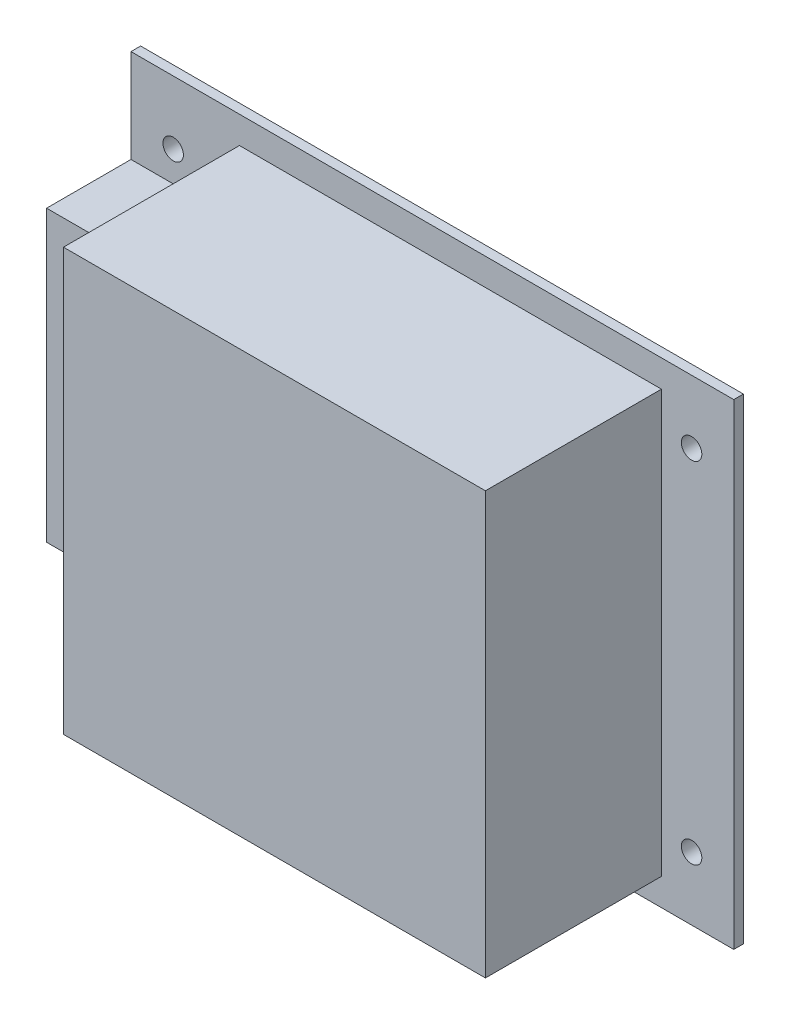
ISO-10303-21;
HEADER;
FILE_DESCRIPTION(('STEP AP214'),'2;1');
FILE_NAME('part.step','',(''),(''),'','','');
FILE_SCHEMA(('AUTOMOTIVE_DESIGN { 1 0 10303 214 1 1 1 1 }'));
ENDSEC;
DATA;
#1=APPLICATION_CONTEXT('core data for automotive mechanical design processes');
#2=APPLICATION_PROTOCOL_DEFINITION('international standard','automotive_design',2000,#1);
#3=PRODUCT_CONTEXT('',#1,'mechanical');
#4=PRODUCT('Part','Part','',(#3));
#5=PRODUCT_RELATED_PRODUCT_CATEGORY('part','',(#4));
#6=PRODUCT_DEFINITION_FORMATION('','',#4);
#7=PRODUCT_DEFINITION_CONTEXT('part definition',#1,'design');
#8=PRODUCT_DEFINITION('design','',#6,#7);
#9=PRODUCT_DEFINITION_SHAPE('','',#8);
#10=(LENGTH_UNIT() NAMED_UNIT(*) SI_UNIT(.MILLI.,.METRE.));
#11=(NAMED_UNIT(*) PLANE_ANGLE_UNIT() SI_UNIT($,.RADIAN.));
#12=(NAMED_UNIT(*) SI_UNIT($,.STERADIAN.) SOLID_ANGLE_UNIT());
#13=UNCERTAINTY_MEASURE_WITH_UNIT(LENGTH_MEASURE(1.E-05),#10,'distance_accuracy_value','');
#14=(GEOMETRIC_REPRESENTATION_CONTEXT(3) GLOBAL_UNCERTAINTY_ASSIGNED_CONTEXT((#13)) GLOBAL_UNIT_ASSIGNED_CONTEXT((#10,
#11,#12)) REPRESENTATION_CONTEXT('',''));
#15=CARTESIAN_POINT('',(0.,0.,0.));
#16=DIRECTION('',(0.,0.,1.));
#17=DIRECTION('',(1.,0.,0.));
#18=AXIS2_PLACEMENT_3D('',#15,#16,#17);
#19=CARTESIAN_POINT('',(-32.,-35.,34.8));
#20=DIRECTION('',(0.,0.,1.));
#21=DIRECTION('',(1.,0.,0.));
#22=AXIS2_PLACEMENT_3D('',#19,#20,#21);
#23=PLANE('',#22);
#24=DIRECTION('',(0.,1.,0.));
#25=VECTOR('',#24,1.);
#26=CARTESIAN_POINT('',(-32.,-35.,34.8));
#27=LINE('',#26,#25);
#28=CARTESIAN_POINT('',(-32.,-35.,34.8));
#29=VERTEX_POINT('',#28);
#30=CARTESIAN_POINT('',(-32.,35.,34.8));
#31=VERTEX_POINT('',#30);
#32=EDGE_CURVE('E271',#29,#31,#27,.T.);
#33=ORIENTED_EDGE('',*,*,#32,.F.);
#34=DIRECTION('',(1.,0.,0.));
#35=VECTOR('',#34,1.);
#36=CARTESIAN_POINT('',(-32.,-35.,34.8));
#37=LINE('',#36,#35);
#38=CARTESIAN_POINT('',(38.,-35.,34.8));
#39=VERTEX_POINT('',#38);
#40=EDGE_CURVE('E237',#29,#39,#37,.T.);
#41=ORIENTED_EDGE('',*,*,#40,.T.);
#42=DIRECTION('',(0.,1.,0.));
#43=VECTOR('',#42,1.);
#44=CARTESIAN_POINT('',(38.,-35.,34.8));
#45=LINE('',#44,#43);
#46=CARTESIAN_POINT('',(38.,35.,34.8));
#47=VERTEX_POINT('',#46);
#48=EDGE_CURVE('E330',#39,#47,#45,.T.);
#49=ORIENTED_EDGE('',*,*,#48,.T.);
#50=DIRECTION('',(1.,0.,0.));
#51=VECTOR('',#50,1.);
#52=CARTESIAN_POINT('',(-32.,35.,34.8));
#53=LINE('',#52,#51);
#54=EDGE_CURVE('E327',#31,#47,#53,.T.);
#55=ORIENTED_EDGE('',*,*,#54,.F.);
#56=EDGE_LOOP('',(#33,#41,#49,#55));
#57=FACE_BOUND('',#56,.T.);
#58=ADVANCED_FACE('F14',(#57),#23,.T.);
#59=CARTESIAN_POINT('',(43.,29.,0.));
#60=DIRECTION('',(0.,0.,1.));
#61=DIRECTION('',(1.,0.,0.));
#62=AXIS2_PLACEMENT_3D('',#59,#60,#61);
#63=PLANE('',#62);
#64=CARTESIAN_POINT('',(43.,29.,0.));
#65=DIRECTION('',(0.,0.,1.));
#66=DIRECTION('',(1.,0.,0.));
#67=AXIS2_PLACEMENT_3D('',#64,#65,#66);
#68=CIRCLE('',#67,1.7);
#69=CARTESIAN_POINT('',(44.7,29.,0.));
#70=VERTEX_POINT('',#69);
#71=EDGE_CURVE('E9',#70,#70,#68,.T.);
#72=ORIENTED_EDGE('',*,*,#71,.T.);
#73=EDGE_LOOP('',(#72));
#74=FACE_BOUND('',#73,.T.);
#75=CARTESIAN_POINT('',(43.,29.,0.));
#76=DIRECTION('',(0.,0.,1.));
#77=DIRECTION('',(1.,0.,0.));
#78=AXIS2_PLACEMENT_3D('',#75,#76,#77);
#79=CIRCLE('',#78,2.5);
#80=CARTESIAN_POINT('',(45.5,29.,0.));
#81=VERTEX_POINT('',#80);
#82=EDGE_CURVE('E197',#81,#81,#79,.T.);
#83=ORIENTED_EDGE('',*,*,#82,.F.);
#84=EDGE_LOOP('',(#83));
#85=FACE_BOUND('',#84,.T.);
#86=ADVANCED_FACE('F434',(#74,#85),#63,.F.);
#87=CARTESIAN_POINT('',(-43.,29.,0.));
#88=DIRECTION('',(0.,0.,1.));
#89=DIRECTION('',(1.,0.,0.));
#90=AXIS2_PLACEMENT_3D('',#87,#88,#89);
#91=PLANE('',#90);
#92=CARTESIAN_POINT('',(-43.,29.,0.));
#93=DIRECTION('',(0.,0.,1.));
#94=DIRECTION('',(1.,0.,0.));
#95=AXIS2_PLACEMENT_3D('',#92,#93,#94);
#96=CIRCLE('',#95,1.7);
#97=CARTESIAN_POINT('',(-41.3,29.,0.));
#98=VERTEX_POINT('',#97);
#99=EDGE_CURVE('E370',#98,#98,#96,.T.);
#100=ORIENTED_EDGE('',*,*,#99,.T.);
#101=EDGE_LOOP('',(#100));
#102=FACE_BOUND('',#101,.T.);
#103=CARTESIAN_POINT('',(-43.,29.,0.));
#104=DIRECTION('',(0.,0.,1.));
#105=DIRECTION('',(1.,0.,0.));
#106=AXIS2_PLACEMENT_3D('',#103,#104,#105);
#107=CIRCLE('',#106,2.5);
#108=CARTESIAN_POINT('',(-40.5,29.,0.));
#109=VERTEX_POINT('',#108);
#110=EDGE_CURVE('E199',#109,#109,#107,.T.);
#111=ORIENTED_EDGE('',*,*,#110,.F.);
#112=EDGE_LOOP('',(#111));
#113=FACE_BOUND('',#112,.T.);
#114=ADVANCED_FACE('F439',(#102,#113),#91,.F.);
#115=CARTESIAN_POINT('',(43.,-29.,0.));
#116=DIRECTION('',(0.,0.,1.));
#117=DIRECTION('',(1.,0.,0.));
#118=AXIS2_PLACEMENT_3D('',#115,#116,#117);
#119=PLANE('',#118);
#120=CARTESIAN_POINT('',(43.,-29.,0.));
#121=DIRECTION('',(0.,0.,1.));
#122=DIRECTION('',(1.,0.,0.));
#123=AXIS2_PLACEMENT_3D('',#120,#121,#122);
#124=CIRCLE('',#123,1.7);
#125=CARTESIAN_POINT('',(44.7,-29.,0.));
#126=VERTEX_POINT('',#125);
#127=EDGE_CURVE('E276',#126,#126,#124,.T.);
#128=ORIENTED_EDGE('',*,*,#127,.T.);
#129=EDGE_LOOP('',(#128));
#130=FACE_BOUND('',#129,.T.);
#131=CARTESIAN_POINT('',(43.,-29.,0.));
#132=DIRECTION('',(0.,0.,1.));
#133=DIRECTION('',(1.,0.,0.));
#134=AXIS2_PLACEMENT_3D('',#131,#132,#133);
#135=CIRCLE('',#134,2.5);
#136=CARTESIAN_POINT('',(45.5,-29.,0.));
#137=VERTEX_POINT('',#136);
#138=EDGE_CURVE('E350',#137,#137,#135,.T.);
#139=ORIENTED_EDGE('',*,*,#138,.F.);
#140=EDGE_LOOP('',(#139));
#141=FACE_BOUND('',#140,.T.);
#142=ADVANCED_FACE('F666',(#130,#141),#119,.F.);
#143=CARTESIAN_POINT('',(-43.,-29.,0.));
#144=DIRECTION('',(0.,0.,1.));
#145=DIRECTION('',(1.,0.,0.));
#146=AXIS2_PLACEMENT_3D('',#143,#144,#145);
#147=PLANE('',#146);
#148=CARTESIAN_POINT('',(-43.,-29.,0.));
#149=DIRECTION('',(0.,0.,1.));
#150=DIRECTION('',(1.,0.,0.));
#151=AXIS2_PLACEMENT_3D('',#148,#149,#150);
#152=CIRCLE('',#151,1.7);
#153=CARTESIAN_POINT('',(-41.3,-29.,0.));
#154=VERTEX_POINT('',#153);
#155=EDGE_CURVE('E323',#154,#154,#152,.T.);
#156=ORIENTED_EDGE('',*,*,#155,.T.);
#157=EDGE_LOOP('',(#156));
#158=FACE_BOUND('',#157,.T.);
#159=CARTESIAN_POINT('',(-43.,-29.,0.));
#160=DIRECTION('',(0.,0.,1.));
#161=DIRECTION('',(1.,0.,0.));
#162=AXIS2_PLACEMENT_3D('',#159,#160,#161);
#163=CIRCLE('',#162,2.5);
#164=CARTESIAN_POINT('',(-40.5,-29.,0.));
#165=VERTEX_POINT('',#164);
#166=EDGE_CURVE('E349',#165,#165,#163,.T.);
#167=ORIENTED_EDGE('',*,*,#166,.F.);
#168=EDGE_LOOP('',(#167));
#169=FACE_BOUND('',#168,.T.);
#170=ADVANCED_FACE('F669',(#158,#169),#147,.F.);
#171=CARTESIAN_POINT('',(43.,29.,-10.));
#172=DIRECTION('',(0.,0.,1.));
#173=DIRECTION('',(1.,0.,0.));
#174=AXIS2_PLACEMENT_3D('',#171,#172,#173);
#175=CYLINDRICAL_SURFACE('',#174,1.7);
#176=DIRECTION('',(0.,0.,1.));
#177=VECTOR('',#176,1.);
#178=CARTESIAN_POINT('',(44.7,29.,-10.));
#179=LINE('',#178,#177);
#180=CARTESIAN_POINT('',(44.7,29.,5.6));
#181=VERTEX_POINT('',#180);
#182=EDGE_CURVE('E24',#70,#181,#179,.T.);
#183=ORIENTED_EDGE('',*,*,#182,.F.);
#184=ORIENTED_EDGE('',*,*,#71,.F.);
#185=ORIENTED_EDGE('',*,*,#182,.T.);
#186=CARTESIAN_POINT('',(43.,29.,5.6));
#187=DIRECTION('',(0.,0.,1.));
#188=DIRECTION('',(1.,0.,0.));
#189=AXIS2_PLACEMENT_3D('',#186,#187,#188);
#190=CIRCLE('',#189,1.7);
#191=EDGE_CURVE('E248',#181,#181,#190,.T.);
#192=ORIENTED_EDGE('',*,*,#191,.T.);
#193=EDGE_LOOP('',(#183,#184,#185,#192));
#194=FACE_BOUND('',#193,.T.);
#195=ADVANCED_FACE('F709',(#194),#175,.F.);
#196=CARTESIAN_POINT('',(-43.,29.,-10.));
#197=DIRECTION('',(0.,0.,1.));
#198=DIRECTION('',(1.,0.,0.));
#199=AXIS2_PLACEMENT_3D('',#196,#197,#198);
#200=CYLINDRICAL_SURFACE('',#199,1.7);
#201=DIRECTION('',(0.,0.,1.));
#202=VECTOR('',#201,1.);
#203=CARTESIAN_POINT('',(-41.3,29.,-10.));
#204=LINE('',#203,#202);
#205=CARTESIAN_POINT('',(-41.3,29.,5.6));
#206=VERTEX_POINT('',#205);
#207=EDGE_CURVE('E279',#98,#206,#204,.T.);
#208=ORIENTED_EDGE('',*,*,#207,.F.);
#209=ORIENTED_EDGE('',*,*,#99,.F.);
#210=ORIENTED_EDGE('',*,*,#207,.T.);
#211=CARTESIAN_POINT('',(-43.,29.,5.6));
#212=DIRECTION('',(0.,0.,1.));
#213=DIRECTION('',(1.,0.,0.));
#214=AXIS2_PLACEMENT_3D('',#211,#212,#213);
#215=CIRCLE('',#214,1.7);
#216=EDGE_CURVE('E244',#206,#206,#215,.T.);
#217=ORIENTED_EDGE('',*,*,#216,.T.);
#218=EDGE_LOOP('',(#208,#209,#210,#217));
#219=FACE_BOUND('',#218,.T.);
#220=ADVANCED_FACE('F707',(#219),#200,.F.);
#221=CARTESIAN_POINT('',(43.,-29.,-10.));
#222=DIRECTION('',(0.,0.,1.));
#223=DIRECTION('',(1.,0.,0.));
#224=AXIS2_PLACEMENT_3D('',#221,#222,#223);
#225=CYLINDRICAL_SURFACE('',#224,1.7);
#226=DIRECTION('',(0.,0.,1.));
#227=VECTOR('',#226,1.);
#228=CARTESIAN_POINT('',(44.7,-29.,-10.));
#229=LINE('',#228,#227);
#230=CARTESIAN_POINT('',(44.7,-29.,5.6));
#231=VERTEX_POINT('',#230);
#232=EDGE_CURVE('E221',#126,#231,#229,.T.);
#233=ORIENTED_EDGE('',*,*,#232,.F.);
#234=ORIENTED_EDGE('',*,*,#127,.F.);
#235=ORIENTED_EDGE('',*,*,#232,.T.);
#236=CARTESIAN_POINT('',(43.,-29.,5.6));
#237=DIRECTION('',(0.,0.,1.));
#238=DIRECTION('',(1.,0.,0.));
#239=AXIS2_PLACEMENT_3D('',#236,#237,#238);
#240=CIRCLE('',#239,1.7);
#241=EDGE_CURVE('E249',#231,#231,#240,.T.);
#242=ORIENTED_EDGE('',*,*,#241,.T.);
#243=EDGE_LOOP('',(#233,#234,#235,#242));
#244=FACE_BOUND('',#243,.T.);
#245=ADVANCED_FACE('F663',(#244),#225,.F.);
#246=CARTESIAN_POINT('',(-43.,-29.,-10.));
#247=DIRECTION('',(0.,0.,1.));
#248=DIRECTION('',(1.,0.,0.));
#249=AXIS2_PLACEMENT_3D('',#246,#247,#248);
#250=CYLINDRICAL_SURFACE('',#249,1.7);
#251=DIRECTION('',(0.,0.,1.));
#252=VECTOR('',#251,1.);
#253=CARTESIAN_POINT('',(-41.3,-29.,-10.));
#254=LINE('',#253,#252);
#255=CARTESIAN_POINT('',(-41.3,-29.,5.6));
#256=VERTEX_POINT('',#255);
#257=EDGE_CURVE('E326',#154,#256,#254,.T.);
#258=ORIENTED_EDGE('',*,*,#257,.F.);
#259=ORIENTED_EDGE('',*,*,#155,.F.);
#260=ORIENTED_EDGE('',*,*,#257,.T.);
#261=CARTESIAN_POINT('',(-43.,-29.,5.6));
#262=DIRECTION('',(0.,0.,1.));
#263=DIRECTION('',(1.,0.,0.));
#264=AXIS2_PLACEMENT_3D('',#261,#262,#263);
#265=CIRCLE('',#264,1.7);
#266=EDGE_CURVE('E286',#256,#256,#265,.T.);
#267=ORIENTED_EDGE('',*,*,#266,.T.);
#268=EDGE_LOOP('',(#258,#259,#260,#267));
#269=FACE_BOUND('',#268,.T.);
#270=ADVANCED_FACE('F716',(#269),#250,.F.);
#271=CARTESIAN_POINT('',(-32.,35.,5.6));
#272=DIRECTION('',(0.,1.,0.));
#273=DIRECTION('',(1.,0.,0.));
#274=AXIS2_PLACEMENT_3D('',#271,#272,#273);
#275=PLANE('',#274);
#276=DIRECTION('',(1.,0.,0.));
#277=VECTOR('',#276,1.);
#278=CARTESIAN_POINT('',(-32.,35.,5.6));
#279=LINE('',#278,#277);
#280=CARTESIAN_POINT('',(-32.,35.,5.6));
#281=VERTEX_POINT('',#280);
#282=CARTESIAN_POINT('',(38.,35.,5.6));
#283=VERTEX_POINT('',#282);
#284=EDGE_CURVE('E308',#281,#283,#279,.T.);
#285=ORIENTED_EDGE('',*,*,#284,.F.);
#286=DIRECTION('',(0.,0.,-1.));
#287=VECTOR('',#286,1.);
#288=CARTESIAN_POINT('',(-32.,35.,34.8));
#289=LINE('',#288,#287);
#290=EDGE_CURVE('E275',#31,#281,#289,.T.);
#291=ORIENTED_EDGE('',*,*,#290,.F.);
#292=ORIENTED_EDGE('',*,*,#54,.T.);
#293=DIRECTION('',(0.,0.,1.));
#294=VECTOR('',#293,1.);
#295=CARTESIAN_POINT('',(38.,35.,5.6));
#296=LINE('',#295,#294);
#297=EDGE_CURVE('E356',#283,#47,#296,.T.);
#298=ORIENTED_EDGE('',*,*,#297,.F.);
#299=EDGE_LOOP('',(#285,#291,#292,#298));
#300=FACE_BOUND('',#299,.T.);
#301=ADVANCED_FACE('F495',(#300),#275,.T.);
#302=CARTESIAN_POINT('',(38.,-35.,5.6));
#303=DIRECTION('',(1.,0.,0.));
#304=DIRECTION('',(0.,1.,0.));
#305=AXIS2_PLACEMENT_3D('',#302,#303,#304);
#306=PLANE('',#305);
#307=DIRECTION('',(0.,0.,1.));
#308=VECTOR('',#307,1.);
#309=CARTESIAN_POINT('',(38.,-35.,5.6));
#310=LINE('',#309,#308);
#311=CARTESIAN_POINT('',(38.,-35.,5.6));
#312=VERTEX_POINT('',#311);
#313=EDGE_CURVE('E233',#312,#39,#310,.T.);
#314=ORIENTED_EDGE('',*,*,#313,.F.);
#315=DIRECTION('',(0.,1.,0.));
#316=VECTOR('',#315,1.);
#317=CARTESIAN_POINT('',(38.,-35.,5.6));
#318=LINE('',#317,#316);
#319=EDGE_CURVE('E314',#312,#283,#318,.T.);
#320=ORIENTED_EDGE('',*,*,#319,.T.);
#321=ORIENTED_EDGE('',*,*,#297,.T.);
#322=ORIENTED_EDGE('',*,*,#48,.F.);
#323=EDGE_LOOP('',(#314,#320,#321,#322));
#324=FACE_BOUND('',#323,.T.);
#325=ADVANCED_FACE('F493',(#324),#306,.T.);
#326=CARTESIAN_POINT('',(-32.,-35.,5.6));
#327=DIRECTION('',(0.,1.,0.));
#328=DIRECTION('',(1.,0.,0.));
#329=AXIS2_PLACEMENT_3D('',#326,#327,#328);
#330=PLANE('',#329);
#331=ORIENTED_EDGE('',*,*,#313,.T.);
#332=ORIENTED_EDGE('',*,*,#40,.F.);
#333=DIRECTION('',(0.,0.,1.));
#334=VECTOR('',#333,1.);
#335=CARTESIAN_POINT('',(-32.,-35.,5.6));
#336=LINE('',#335,#334);
#337=CARTESIAN_POINT('',(-32.,-35.,5.6));
#338=VERTEX_POINT('',#337);
#339=EDGE_CURVE('E238',#338,#29,#336,.T.);
#340=ORIENTED_EDGE('',*,*,#339,.F.);
#341=DIRECTION('',(1.,0.,0.));
#342=VECTOR('',#341,1.);
#343=CARTESIAN_POINT('',(-32.,-35.,5.6));
#344=LINE('',#343,#342);
#345=EDGE_CURVE('E285',#338,#312,#344,.T.);
#346=ORIENTED_EDGE('',*,*,#345,.T.);
#347=EDGE_LOOP('',(#331,#332,#340,#346));
#348=FACE_BOUND('',#347,.T.);
#349=ADVANCED_FACE('F448',(#348),#330,.F.);
#350=CARTESIAN_POINT('',(-32.,-35.,5.6));
#351=DIRECTION('',(1.,0.,0.));
#352=DIRECTION('',(0.,1.,0.));
#353=AXIS2_PLACEMENT_3D('',#350,#351,#352);
#354=PLANE('',#353);
#355=ORIENTED_EDGE('',*,*,#32,.T.);
#356=ORIENTED_EDGE('',*,*,#290,.T.);
#357=DIRECTION('',(0.,1.,0.));
#358=VECTOR('',#357,1.);
#359=CARTESIAN_POINT('',(-32.,-35.,5.6));
#360=LINE('',#359,#358);
#361=CARTESIAN_POINT('',(-32.,24.,5.6));
#362=VERTEX_POINT('',#361);
#363=EDGE_CURVE('E304',#362,#281,#360,.T.);
#364=ORIENTED_EDGE('',*,*,#363,.F.);
#365=DIRECTION('',(0.,0.,1.));
#366=VECTOR('',#365,1.);
#367=CARTESIAN_POINT('',(-32.,24.,5.6));
#368=LINE('',#367,#366);
#369=CARTESIAN_POINT('',(-32.,24.,19.6));
#370=VERTEX_POINT('',#369);
#371=EDGE_CURVE('E335',#362,#370,#368,.T.);
#372=ORIENTED_EDGE('',*,*,#371,.T.);
#373=DIRECTION('',(0.,1.,0.));
#374=VECTOR('',#373,1.);
#375=CARTESIAN_POINT('',(-32.,-24.,19.6));
#376=LINE('',#375,#374);
#377=CARTESIAN_POINT('',(-32.,-24.,19.6));
#378=VERTEX_POINT('',#377);
#379=EDGE_CURVE('E322',#378,#370,#376,.T.);
#380=ORIENTED_EDGE('',*,*,#379,.F.);
#381=DIRECTION('',(0.,0.,1.));
#382=VECTOR('',#381,1.);
#383=CARTESIAN_POINT('',(-32.,-24.,5.6));
#384=LINE('',#383,#382);
#385=CARTESIAN_POINT('',(-32.,-24.,5.6));
#386=VERTEX_POINT('',#385);
#387=EDGE_CURVE('E318',#386,#378,#384,.T.);
#388=ORIENTED_EDGE('',*,*,#387,.F.);
#389=DIRECTION('',(0.,1.,0.));
#390=VECTOR('',#389,1.);
#391=CARTESIAN_POINT('',(-32.,-35.,5.6));
#392=LINE('',#391,#390);
#393=EDGE_CURVE('E280',#338,#386,#392,.T.);
#394=ORIENTED_EDGE('',*,*,#393,.F.);
#395=ORIENTED_EDGE('',*,*,#339,.T.);
#396=EDGE_LOOP('',(#355,#356,#364,#372,#380,#388,#394,#395));
#397=FACE_BOUND('',#396,.T.);
#398=ADVANCED_FACE('F413',(#397),#354,.F.);
#399=CARTESIAN_POINT('',(43.,29.,0.));
#400=DIRECTION('',(0.,0.,1.));
#401=DIRECTION('',(1.,0.,0.));
#402=AXIS2_PLACEMENT_3D('',#399,#400,#401);
#403=CYLINDRICAL_SURFACE('',#402,2.5);
#404=CARTESIAN_POINT('',(43.,29.,4.));
#405=DIRECTION('',(0.,0.,1.));
#406=DIRECTION('',(1.,0.,0.));
#407=AXIS2_PLACEMENT_3D('',#404,#405,#406);
#408=CIRCLE('',#407,2.5);
#409=CARTESIAN_POINT('',(45.5,29.,4.));
#410=VERTEX_POINT('',#409);
#411=EDGE_CURVE('E195',#410,#410,#408,.T.);
#412=ORIENTED_EDGE('',*,*,#411,.F.);
#413=DIRECTION('',(0.,0.,1.));
#414=VECTOR('',#413,1.);
#415=CARTESIAN_POINT('',(45.5,29.,0.));
#416=LINE('',#415,#414);
#417=EDGE_CURVE('E192',#81,#410,#416,.T.);
#418=ORIENTED_EDGE('',*,*,#417,.F.);
#419=ORIENTED_EDGE('',*,*,#82,.T.);
#420=ORIENTED_EDGE('',*,*,#417,.T.);
#421=EDGE_LOOP('',(#412,#418,#419,#420));
#422=FACE_BOUND('',#421,.T.);
#423=ADVANCED_FACE('F194',(#422),#403,.T.);
#424=CARTESIAN_POINT('',(-43.,29.,0.));
#425=DIRECTION('',(0.,0.,1.));
#426=DIRECTION('',(1.,0.,0.));
#427=AXIS2_PLACEMENT_3D('',#424,#425,#426);
#428=CYLINDRICAL_SURFACE('',#427,2.5);
#429=CARTESIAN_POINT('',(-43.,29.,4.));
#430=DIRECTION('',(0.,0.,1.));
#431=DIRECTION('',(1.,0.,0.));
#432=AXIS2_PLACEMENT_3D('',#429,#430,#431);
#433=CIRCLE('',#432,2.5);
#434=CARTESIAN_POINT('',(-40.5,29.,4.));
#435=VERTEX_POINT('',#434);
#436=EDGE_CURVE('E206',#435,#435,#433,.T.);
#437=ORIENTED_EDGE('',*,*,#436,.F.);
#438=DIRECTION('',(0.,0.,1.));
#439=VECTOR('',#438,1.);
#440=CARTESIAN_POINT('',(-40.5,29.,0.));
#441=LINE('',#440,#439);
#442=EDGE_CURVE('E226',#109,#435,#441,.T.);
#443=ORIENTED_EDGE('',*,*,#442,.F.);
#444=ORIENTED_EDGE('',*,*,#110,.T.);
#445=ORIENTED_EDGE('',*,*,#442,.T.);
#446=EDGE_LOOP('',(#437,#443,#444,#445));
#447=FACE_BOUND('',#446,.T.);
#448=ADVANCED_FACE('F705',(#447),#428,.T.);
#449=CARTESIAN_POINT('',(43.,-29.,0.));
#450=DIRECTION('',(0.,0.,1.));
#451=DIRECTION('',(1.,0.,0.));
#452=AXIS2_PLACEMENT_3D('',#449,#450,#451);
#453=CYLINDRICAL_SURFACE('',#452,2.5);
#454=CARTESIAN_POINT('',(43.,-29.,4.));
#455=DIRECTION('',(0.,0.,1.));
#456=DIRECTION('',(1.,0.,0.));
#457=AXIS2_PLACEMENT_3D('',#454,#455,#456);
#458=CIRCLE('',#457,2.5);
#459=CARTESIAN_POINT('',(45.5,-29.,4.));
#460=VERTEX_POINT('',#459);
#461=EDGE_CURVE('E217',#460,#460,#458,.T.);
#462=ORIENTED_EDGE('',*,*,#461,.F.);
#463=DIRECTION('',(0.,0.,1.));
#464=VECTOR('',#463,1.);
#465=CARTESIAN_POINT('',(45.5,-29.,0.));
#466=LINE('',#465,#464);
#467=EDGE_CURVE('E353',#137,#460,#466,.T.);
#468=ORIENTED_EDGE('',*,*,#467,.F.);
#469=ORIENTED_EDGE('',*,*,#138,.T.);
#470=ORIENTED_EDGE('',*,*,#467,.T.);
#471=EDGE_LOOP('',(#462,#468,#469,#470));
#472=FACE_BOUND('',#471,.T.);
#473=ADVANCED_FACE('F675',(#472),#453,.T.);
#474=CARTESIAN_POINT('',(-43.,-29.,0.));
#475=DIRECTION('',(0.,0.,1.));
#476=DIRECTION('',(1.,0.,0.));
#477=AXIS2_PLACEMENT_3D('',#474,#475,#476);
#478=CYLINDRICAL_SURFACE('',#477,2.5);
#479=CARTESIAN_POINT('',(-43.,-29.,4.));
#480=DIRECTION('',(0.,0.,1.));
#481=DIRECTION('',(1.,0.,0.));
#482=AXIS2_PLACEMENT_3D('',#479,#480,#481);
#483=CIRCLE('',#482,2.5);
#484=CARTESIAN_POINT('',(-40.5,-29.,4.));
#485=VERTEX_POINT('',#484);
#486=EDGE_CURVE('E242',#485,#485,#483,.T.);
#487=ORIENTED_EDGE('',*,*,#486,.F.);
#488=DIRECTION('',(0.,0.,1.));
#489=VECTOR('',#488,1.);
#490=CARTESIAN_POINT('',(-40.5,-29.,0.));
#491=LINE('',#490,#489);
#492=EDGE_CURVE('E321',#165,#485,#491,.T.);
#493=ORIENTED_EDGE('',*,*,#492,.F.);
#494=ORIENTED_EDGE('',*,*,#166,.T.);
#495=ORIENTED_EDGE('',*,*,#492,.T.);
#496=EDGE_LOOP('',(#487,#493,#494,#495));
#497=FACE_BOUND('',#496,.T.);
#498=ADVANCED_FACE('F712',(#497),#478,.T.);
#499=CARTESIAN_POINT('',(50.,-39.5,4.));
#500=DIRECTION('',(1.,0.,0.));
#501=DIRECTION('',(0.,1.,0.));
#502=AXIS2_PLACEMENT_3D('',#499,#500,#501);
#503=PLANE('',#502);
#504=DIRECTION('',(0.,0.,1.));
#505=VECTOR('',#504,1.);
#506=CARTESIAN_POINT('',(50.,-39.5,4.));
#507=LINE('',#506,#505);
#508=CARTESIAN_POINT('',(50.,-39.5,4.));
#509=VERTEX_POINT('',#508);
#510=CARTESIAN_POINT('',(50.,-39.5,5.6));
#511=VERTEX_POINT('',#510);
#512=EDGE_CURVE('E300',#509,#511,#507,.T.);
#513=ORIENTED_EDGE('',*,*,#512,.F.);
#514=DIRECTION('',(0.,1.,0.));
#515=VECTOR('',#514,1.);
#516=CARTESIAN_POINT('',(50.,-39.5,4.));
#517=LINE('',#516,#515);
#518=CARTESIAN_POINT('',(50.,39.5,4.));
#519=VERTEX_POINT('',#518);
#520=EDGE_CURVE('E239',#509,#519,#517,.T.);
#521=ORIENTED_EDGE('',*,*,#520,.T.);
#522=DIRECTION('',(0.,0.,1.));
#523=VECTOR('',#522,1.);
#524=CARTESIAN_POINT('',(50.,39.5,4.));
#525=LINE('',#524,#523);
#526=CARTESIAN_POINT('',(50.,39.5,5.6));
#527=VERTEX_POINT('',#526);
#528=EDGE_CURVE('E214',#519,#527,#525,.T.);
#529=ORIENTED_EDGE('',*,*,#528,.T.);
#530=DIRECTION('',(0.,1.,0.));
#531=VECTOR('',#530,1.);
#532=CARTESIAN_POINT('',(50.,-39.5,5.6));
#533=LINE('',#532,#531);
#534=EDGE_CURVE('E301',#511,#527,#533,.T.);
#535=ORIENTED_EDGE('',*,*,#534,.F.);
#536=EDGE_LOOP('',(#513,#521,#529,#535));
#537=FACE_BOUND('',#536,.T.);
#538=ADVANCED_FACE('F429',(#537),#503,.T.);
#539=CARTESIAN_POINT('',(-50.,-24.,5.6));
#540=DIRECTION('',(0.,1.,0.));
#541=DIRECTION('',(1.,0.,0.));
#542=AXIS2_PLACEMENT_3D('',#539,#540,#541);
#543=PLANE('',#542);
#544=ORIENTED_EDGE('',*,*,#387,.T.);
#545=DIRECTION('',(1.,0.,0.));
#546=VECTOR('',#545,1.);
#547=CARTESIAN_POINT('',(-50.,-24.,19.6));
#548=LINE('',#547,#546);
#549=CARTESIAN_POINT('',(-50.,-24.,19.6));
#550=VERTEX_POINT('',#549);
#551=EDGE_CURVE('E99',#550,#378,#548,.T.);
#552=ORIENTED_EDGE('',*,*,#551,.F.);
#553=DIRECTION('',(0.,0.,1.));
#554=VECTOR('',#553,1.);
#555=CARTESIAN_POINT('',(-50.,-24.,5.6));
#556=LINE('',#555,#554);
#557=CARTESIAN_POINT('',(-50.,-24.,5.6));
#558=VERTEX_POINT('',#557);
#559=EDGE_CURVE('E264',#558,#550,#556,.T.);
#560=ORIENTED_EDGE('',*,*,#559,.F.);
#561=DIRECTION('',(1.,0.,0.));
#562=VECTOR('',#561,1.);
#563=CARTESIAN_POINT('',(-50.,-24.,5.6));
#564=LINE('',#563,#562);
#565=EDGE_CURVE('E284',#558,#386,#564,.T.);
#566=ORIENTED_EDGE('',*,*,#565,.T.);
#567=EDGE_LOOP('',(#544,#552,#560,#566));
#568=FACE_BOUND('',#567,.T.);
#569=ADVANCED_FACE('F420',(#568),#543,.F.);
#570=CARTESIAN_POINT('',(-50.,-24.,19.6));
#571=DIRECTION('',(0.,0.,1.));
#572=DIRECTION('',(1.,0.,0.));
#573=AXIS2_PLACEMENT_3D('',#570,#571,#572);
#574=PLANE('',#573);
#575=DIRECTION('',(0.,1.,0.));
#576=VECTOR('',#575,1.);
#577=CARTESIAN_POINT('',(-50.,-24.,19.6));
#578=LINE('',#577,#576);
#579=CARTESIAN_POINT('',(-50.,24.,19.6));
#580=VERTEX_POINT('',#579);
#581=EDGE_CURVE('E259',#550,#580,#578,.T.);
#582=ORIENTED_EDGE('',*,*,#581,.F.);
#583=ORIENTED_EDGE('',*,*,#551,.T.);
#584=ORIENTED_EDGE('',*,*,#379,.T.);
#585=DIRECTION('',(1.,0.,0.));
#586=VECTOR('',#585,1.);
#587=CARTESIAN_POINT('',(-50.,24.,19.6));
#588=LINE('',#587,#586);
#589=EDGE_CURVE('E87',#580,#370,#588,.T.);
#590=ORIENTED_EDGE('',*,*,#589,.F.);
#591=EDGE_LOOP('',(#582,#583,#584,#590));
#592=FACE_BOUND('',#591,.T.);
#593=ADVANCED_FACE('F418',(#592),#574,.T.);
#594=CARTESIAN_POINT('',(-50.,24.,5.6));
#595=DIRECTION('',(0.,1.,0.));
#596=DIRECTION('',(1.,0.,0.));
#597=AXIS2_PLACEMENT_3D('',#594,#595,#596);
#598=PLANE('',#597);
#599=DIRECTION('',(1.,0.,0.));
#600=VECTOR('',#599,1.);
#601=CARTESIAN_POINT('',(-50.,24.,5.6));
#602=LINE('',#601,#600);
#603=CARTESIAN_POINT('',(-50.,24.,5.6));
#604=VERTEX_POINT('',#603);
#605=EDGE_CURVE('E17',#604,#362,#602,.T.);
#606=ORIENTED_EDGE('',*,*,#605,.F.);
#607=DIRECTION('',(0.,0.,1.));
#608=VECTOR('',#607,1.);
#609=CARTESIAN_POINT('',(-50.,24.,5.6));
#610=LINE('',#609,#608);
#611=EDGE_CURVE('E263',#604,#580,#610,.T.);
#612=ORIENTED_EDGE('',*,*,#611,.T.);
#613=ORIENTED_EDGE('',*,*,#589,.T.);
#614=ORIENTED_EDGE('',*,*,#371,.F.);
#615=EDGE_LOOP('',(#606,#612,#613,#614));
#616=FACE_BOUND('',#615,.T.);
#617=ADVANCED_FACE('F414',(#616),#598,.T.);
#618=CARTESIAN_POINT('',(-50.,-39.5,5.6));
#619=DIRECTION('',(0.,0.,1.));
#620=DIRECTION('',(1.,0.,0.));
#621=AXIS2_PLACEMENT_3D('',#618,#619,#620);
#622=PLANE('',#621);
#623=ORIENTED_EDGE('',*,*,#191,.F.);
#624=EDGE_LOOP('',(#623));
#625=FACE_BOUND('',#624,.T.);
#626=ORIENTED_EDGE('',*,*,#216,.F.);
#627=EDGE_LOOP('',(#626));
#628=FACE_BOUND('',#627,.T.);
#629=ORIENTED_EDGE('',*,*,#241,.F.);
#630=EDGE_LOOP('',(#629));
#631=FACE_BOUND('',#630,.T.);
#632=ORIENTED_EDGE('',*,*,#266,.F.);
#633=EDGE_LOOP('',(#632));
#634=FACE_BOUND('',#633,.T.);
#635=DIRECTION('',(0.,1.,0.));
#636=VECTOR('',#635,1.);
#637=CARTESIAN_POINT('',(-50.,-39.5,5.6));
#638=LINE('',#637,#636);
#639=CARTESIAN_POINT('',(-50.,-39.5,5.6));
#640=VERTEX_POINT('',#639);
#641=EDGE_CURVE('E336',#640,#558,#638,.T.);
#642=ORIENTED_EDGE('',*,*,#641,.F.);
#643=DIRECTION('',(1.,0.,0.));
#644=VECTOR('',#643,1.);
#645=CARTESIAN_POINT('',(-50.,-39.5,5.6));
#646=LINE('',#645,#644);
#647=EDGE_CURVE('E232',#640,#511,#646,.T.);
#648=ORIENTED_EDGE('',*,*,#647,.T.);
#649=ORIENTED_EDGE('',*,*,#534,.T.);
#650=DIRECTION('',(1.,0.,0.));
#651=VECTOR('',#650,1.);
#652=CARTESIAN_POINT('',(-50.,39.5,5.6));
#653=LINE('',#652,#651);
#654=CARTESIAN_POINT('',(-50.,39.5,5.6));
#655=VERTEX_POINT('',#654);
#656=EDGE_CURVE('E205',#655,#527,#653,.T.);
#657=ORIENTED_EDGE('',*,*,#656,.F.);
#658=DIRECTION('',(0.,1.,0.));
#659=VECTOR('',#658,1.);
#660=CARTESIAN_POINT('',(-50.,-39.5,5.6));
#661=LINE('',#660,#659);
#662=EDGE_CURVE('E255',#604,#655,#661,.T.);
#663=ORIENTED_EDGE('',*,*,#662,.F.);
#664=ORIENTED_EDGE('',*,*,#605,.T.);
#665=ORIENTED_EDGE('',*,*,#363,.T.);
#666=ORIENTED_EDGE('',*,*,#284,.T.);
#667=ORIENTED_EDGE('',*,*,#319,.F.);
#668=ORIENTED_EDGE('',*,*,#345,.F.);
#669=ORIENTED_EDGE('',*,*,#393,.T.);
#670=ORIENTED_EDGE('',*,*,#565,.F.);
#671=EDGE_LOOP('',(#642,#648,#649,#657,#663,#664,#665,#666,#667,#668,#669,#670));
#672=FACE_BOUND('',#671,.T.);
#673=ADVANCED_FACE('F427',(#625,#628,#631,#634,#672),#622,.T.);
#674=CARTESIAN_POINT('',(-50.,39.5,4.));
#675=DIRECTION('',(0.,1.,0.));
#676=DIRECTION('',(1.,0.,0.));
#677=AXIS2_PLACEMENT_3D('',#674,#675,#676);
#678=PLANE('',#677);
#679=DIRECTION('',(1.,0.,0.));
#680=VECTOR('',#679,1.);
#681=CARTESIAN_POINT('',(-50.,39.5,4.));
#682=LINE('',#681,#680);
#683=CARTESIAN_POINT('',(-50.,39.5,4.));
#684=VERTEX_POINT('',#683);
#685=EDGE_CURVE('E231',#684,#519,#682,.T.);
#686=ORIENTED_EDGE('',*,*,#685,.F.);
#687=DIRECTION('',(0.,0.,1.));
#688=VECTOR('',#687,1.);
#689=CARTESIAN_POINT('',(-50.,39.5,4.));
#690=LINE('',#689,#688);
#691=EDGE_CURVE('E250',#684,#655,#690,.T.);
#692=ORIENTED_EDGE('',*,*,#691,.T.);
#693=ORIENTED_EDGE('',*,*,#656,.T.);
#694=ORIENTED_EDGE('',*,*,#528,.F.);
#695=EDGE_LOOP('',(#686,#692,#693,#694));
#696=FACE_BOUND('',#695,.T.);
#697=ADVANCED_FACE('F680',(#696),#678,.T.);
#698=CARTESIAN_POINT('',(-50.,-39.5,4.));
#699=DIRECTION('',(0.,0.,1.));
#700=DIRECTION('',(1.,0.,0.));
#701=AXIS2_PLACEMENT_3D('',#698,#699,#700);
#702=PLANE('',#701);
#703=ORIENTED_EDGE('',*,*,#411,.T.);
#704=EDGE_LOOP('',(#703));
#705=FACE_BOUND('',#704,.T.);
#706=ORIENTED_EDGE('',*,*,#436,.T.);
#707=EDGE_LOOP('',(#706));
#708=FACE_BOUND('',#707,.T.);
#709=ORIENTED_EDGE('',*,*,#461,.T.);
#710=EDGE_LOOP('',(#709));
#711=FACE_BOUND('',#710,.T.);
#712=ORIENTED_EDGE('',*,*,#486,.T.);
#713=EDGE_LOOP('',(#712));
#714=FACE_BOUND('',#713,.T.);
#715=ORIENTED_EDGE('',*,*,#685,.T.);
#716=ORIENTED_EDGE('',*,*,#520,.F.);
#717=DIRECTION('',(1.,0.,0.));
#718=VECTOR('',#717,1.);
#719=CARTESIAN_POINT('',(-50.,-39.5,4.));
#720=LINE('',#719,#718);
#721=CARTESIAN_POINT('',(-50.,-39.5,4.));
#722=VERTEX_POINT('',#721);
#723=EDGE_CURVE('E227',#722,#509,#720,.T.);
#724=ORIENTED_EDGE('',*,*,#723,.F.);
#725=DIRECTION('',(0.,1.,0.));
#726=VECTOR('',#725,1.);
#727=CARTESIAN_POINT('',(-50.,-39.5,4.));
#728=LINE('',#727,#726);
#729=EDGE_CURVE('E254',#722,#684,#728,.T.);
#730=ORIENTED_EDGE('',*,*,#729,.T.);
#731=EDGE_LOOP('',(#715,#716,#724,#730));
#732=FACE_BOUND('',#731,.T.);
#733=ADVANCED_FACE('F202',(#705,#708,#711,#714,#732),#702,.F.);
#734=CARTESIAN_POINT('',(-50.,-39.5,4.));
#735=DIRECTION('',(0.,1.,0.));
#736=DIRECTION('',(1.,0.,0.));
#737=AXIS2_PLACEMENT_3D('',#734,#735,#736);
#738=PLANE('',#737);
#739=ORIENTED_EDGE('',*,*,#512,.T.);
#740=ORIENTED_EDGE('',*,*,#647,.F.);
#741=DIRECTION('',(0.,0.,1.));
#742=VECTOR('',#741,1.);
#743=CARTESIAN_POINT('',(-50.,-39.5,4.));
#744=LINE('',#743,#742);
#745=EDGE_CURVE('E296',#722,#640,#744,.T.);
#746=ORIENTED_EDGE('',*,*,#745,.F.);
#747=ORIENTED_EDGE('',*,*,#723,.T.);
#748=EDGE_LOOP('',(#739,#740,#746,#747));
#749=FACE_BOUND('',#748,.T.);
#750=ADVANCED_FACE('F679',(#749),#738,.F.);
#751=CARTESIAN_POINT('',(-50.,-39.5,4.));
#752=DIRECTION('',(1.,0.,0.));
#753=DIRECTION('',(0.,1.,0.));
#754=AXIS2_PLACEMENT_3D('',#751,#752,#753);
#755=PLANE('',#754);
#756=ORIENTED_EDGE('',*,*,#641,.T.);
#757=ORIENTED_EDGE('',*,*,#559,.T.);
#758=ORIENTED_EDGE('',*,*,#581,.T.);
#759=ORIENTED_EDGE('',*,*,#611,.F.);
#760=ORIENTED_EDGE('',*,*,#662,.T.);
#761=ORIENTED_EDGE('',*,*,#691,.F.);
#762=ORIENTED_EDGE('',*,*,#729,.F.);
#763=ORIENTED_EDGE('',*,*,#745,.T.);
#764=EDGE_LOOP('',(#756,#757,#758,#759,#760,#761,#762,#763));
#765=FACE_BOUND('',#764,.T.);
#766=ADVANCED_FACE('F417',(#765),#755,.F.);
#767=CLOSED_SHELL('',(#58,#86,#114,#142,#170,#195,#220,#245,#270,#301,#325,#349,#398,#423,#448,
#473,#498,#538,#569,#593,#617,#673,#697,#733,#750,#766));
#768=MANIFOLD_SOLID_BREP('B1',#767);
#769=ADVANCED_BREP_SHAPE_REPRESENTATION('',(#18,#768),#14);
#770=SHAPE_DEFINITION_REPRESENTATION(#9,#769);
ENDSEC;
END-ISO-10303-21;
